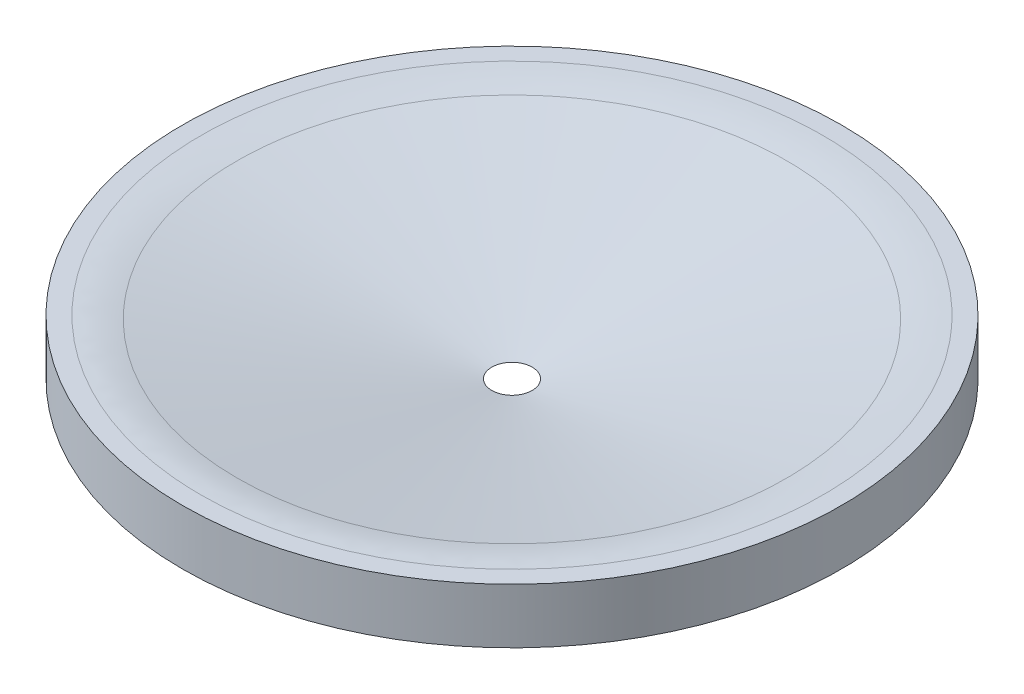
ISO-10303-21;
HEADER;
FILE_DESCRIPTION(('STEP AP214'),'2;1');
FILE_NAME('part.step','',(''),(''),'','','');
FILE_SCHEMA(('AUTOMOTIVE_DESIGN { 1 0 10303 214 1 1 1 1 }'));
ENDSEC;
DATA;
#1=APPLICATION_CONTEXT('core data for automotive mechanical design processes');
#2=APPLICATION_PROTOCOL_DEFINITION('international standard','automotive_design',2000,#1);
#3=PRODUCT_CONTEXT('',#1,'mechanical');
#4=PRODUCT('Part','Part','',(#3));
#5=PRODUCT_RELATED_PRODUCT_CATEGORY('part','',(#4));
#6=PRODUCT_DEFINITION_FORMATION('','',#4);
#7=PRODUCT_DEFINITION_CONTEXT('part definition',#1,'design');
#8=PRODUCT_DEFINITION('design','',#6,#7);
#9=PRODUCT_DEFINITION_SHAPE('','',#8);
#10=(LENGTH_UNIT() NAMED_UNIT(*) SI_UNIT(.MILLI.,.METRE.));
#11=(NAMED_UNIT(*) PLANE_ANGLE_UNIT() SI_UNIT($,.RADIAN.));
#12=(NAMED_UNIT(*) SI_UNIT($,.STERADIAN.) SOLID_ANGLE_UNIT());
#13=UNCERTAINTY_MEASURE_WITH_UNIT(LENGTH_MEASURE(1.E-05),#10,'distance_accuracy_value','');
#14=(GEOMETRIC_REPRESENTATION_CONTEXT(3) GLOBAL_UNCERTAINTY_ASSIGNED_CONTEXT((#13)) GLOBAL_UNIT_ASSIGNED_CONTEXT((#10,
#11,#12)) REPRESENTATION_CONTEXT('',''));
#15=CARTESIAN_POINT('',(0.,0.,0.));
#16=DIRECTION('',(0.,0.,1.));
#17=DIRECTION('',(1.,0.,0.));
#18=AXIS2_PLACEMENT_3D('',#15,#16,#17);
#19=CARTESIAN_POINT('',(0.,2.8019801980198,14.969801980198));
#20=CARTESIAN_POINT('',(0.979763120824126,2.8019801980198,14.969801980198));
#21=CARTESIAN_POINT('',(2.93928936247239,2.8019801980198,14.7768054907429));
#22=CARTESIAN_POINT('',(5.76562348311741,2.8019801980198,13.919446408479));
#23=CARTESIAN_POINT('',(8.37038792670522,2.8019801980198,12.5271708068526));
#24=CARTESIAN_POINT('',(10.6534830564372,2.8019801980198,10.6534830564373));
#25=CARTESIAN_POINT('',(12.5271708068526,2.8019801980198,8.3703879267052));
#26=CARTESIAN_POINT('',(13.9194464084789,2.8019801980198,5.76562348311746));
#27=CARTESIAN_POINT('',(14.7768054907429,2.8019801980198,2.93928936247243));
#28=CARTESIAN_POINT('',(15.0663002249256,2.8019801980198,0.));
#29=CARTESIAN_POINT('',(14.7768054907429,2.8019801980198,-2.93928936247238));
#30=CARTESIAN_POINT('',(13.919446408479,2.8019801980198,-5.76562348311741));
#31=CARTESIAN_POINT('',(12.5271708068526,2.8019801980198,-8.37038792670521));
#32=CARTESIAN_POINT('',(10.6534830564373,2.8019801980198,-10.6534830564372));
#33=CARTESIAN_POINT('',(8.3703879267052,2.8019801980198,-12.5271708068526));
#34=CARTESIAN_POINT('',(5.76562348311747,2.8019801980198,-13.9194464084789));
#35=CARTESIAN_POINT('',(2.93928936247242,2.8019801980198,-14.7768054907429));
#36=CARTESIAN_POINT('',(0.,2.8019801980198,-15.0663002249256));
#37=CARTESIAN_POINT('',(-2.93928936247236,2.8019801980198,-14.7768054907429));
#38=CARTESIAN_POINT('',(-5.76562348311742,2.8019801980198,-13.919446408479));
#39=CARTESIAN_POINT('',(-8.37038792670518,2.8019801980198,-12.5271708068526));
#40=CARTESIAN_POINT('',(-10.6534830564373,2.8019801980198,-10.6534830564373));
#41=CARTESIAN_POINT('',(-12.5271708068526,2.8019801980198,-8.37038792670521));
#42=CARTESIAN_POINT('',(-13.9194464084789,2.8019801980198,-5.76562348311746));
#43=CARTESIAN_POINT('',(-14.7768054907429,2.8019801980198,-2.93928936247243));
#44=CARTESIAN_POINT('',(-15.0663002249256,2.8019801980198,0.));
#45=CARTESIAN_POINT('',(-14.7768054907429,2.8019801980198,2.93928936247237));
#46=CARTESIAN_POINT('',(-13.9194464084789,2.8019801980198,5.76562348311746));
#47=CARTESIAN_POINT('',(-12.5271708068526,2.8019801980198,8.37038792670518));
#48=CARTESIAN_POINT('',(-10.6534830564373,2.8019801980198,10.6534830564373));
#49=CARTESIAN_POINT('',(-8.37038792670519,2.8019801980198,12.5271708068526));
#50=CARTESIAN_POINT('',(-5.76562348311744,2.8019801980198,13.9194464084789));
#51=CARTESIAN_POINT('',(-2.93928936247239,2.8019801980198,14.7768054907429));
#52=CARTESIAN_POINT('',(-0.97976312082413,2.8019801980198,14.969801980198));
#53=CARTESIAN_POINT('',(0.,2.8019801980198,14.969801980198));
#54=CARTESIAN_POINT('',(0.,2.83905349455881,15.1533147980661));
#55=CARTESIAN_POINT('',(0.991773907031153,2.83905349455881,15.1533147980661));
#56=CARTESIAN_POINT('',(2.97532172109347,2.83905349455881,14.9579523902331));
#57=CARTESIAN_POINT('',(5.83630349702493,2.83905349455881,14.0900830566432));
#58=CARTESIAN_POINT('',(8.47299940260254,2.83905349455881,12.6807397329961));
#59=CARTESIAN_POINT('',(10.7840826928508,2.83905349455881,10.7840826928509));
#60=CARTESIAN_POINT('',(12.6807397329962,2.83905349455881,8.47299940260252));
#61=CARTESIAN_POINT('',(14.0900830566432,2.83905349455881,5.83630349702498));
#62=CARTESIAN_POINT('',(14.9579523902331,2.83905349455881,2.97532172109351));
#63=CARTESIAN_POINT('',(15.2509960019826,2.83905349455881,0.));
#64=CARTESIAN_POINT('',(14.9579523902331,2.83905349455881,-2.97532172109346));
#65=CARTESIAN_POINT('',(14.0900830566433,2.83905349455881,-5.83630349702495));
#66=CARTESIAN_POINT('',(12.6807397329961,2.83905349455881,-8.47299940260253));
#67=CARTESIAN_POINT('',(10.7840826928509,2.83905349455881,-10.7840826928508));
#68=CARTESIAN_POINT('',(8.47299940260252,2.83905349455881,-12.6807397329962));
#69=CARTESIAN_POINT('',(5.83630349702499,2.83905349455881,-14.0900830566432));
#70=CARTESIAN_POINT('',(2.9753217210935,2.83905349455881,-14.9579523902331));
#71=CARTESIAN_POINT('',(0.,2.83905349455881,-15.2509960019826));
#72=CARTESIAN_POINT('',(-2.97532172109344,2.83905349455881,-14.9579523902331));
#73=CARTESIAN_POINT('',(-5.83630349702495,2.83905349455881,-14.0900830566432));
#74=CARTESIAN_POINT('',(-8.47299940260249,2.83905349455881,-12.6807397329962));
#75=CARTESIAN_POINT('',(-10.7840826928509,2.83905349455882,-10.7840826928508));
#76=CARTESIAN_POINT('',(-12.6807397329961,2.83905349455881,-8.47299940260253));
#77=CARTESIAN_POINT('',(-14.0900830566432,2.83905349455881,-5.83630349702499));
#78=CARTESIAN_POINT('',(-14.9579523902331,2.83905349455881,-2.97532172109351));
#79=CARTESIAN_POINT('',(-15.2509960019826,2.83905349455881,0.));
#80=CARTESIAN_POINT('',(-14.9579523902331,2.83905349455881,2.97532172109344));
#81=CARTESIAN_POINT('',(-14.0900830566432,2.83905349455882,5.836303497025));
#82=CARTESIAN_POINT('',(-12.6807397329962,2.8390534945588,8.47299940260248));
#83=CARTESIAN_POINT('',(-10.7840826928509,2.83905349455882,10.7840826928509));
#84=CARTESIAN_POINT('',(-8.47299940260252,2.83905349455881,12.6807397329962));
#85=CARTESIAN_POINT('',(-5.83630349702497,2.83905349455881,14.0900830566432));
#86=CARTESIAN_POINT('',(-2.97532172109347,2.83905349455881,14.9579523902331));
#87=CARTESIAN_POINT('',(-0.991773907031157,2.83905349455881,15.1533147980661));
#88=CARTESIAN_POINT('',(0.,2.83905349455881,15.1533147980661));
#89=CARTESIAN_POINT('',(0.,2.87612679109782,15.3368276159342));
#90=CARTESIAN_POINT('',(1.00378469323818,2.87612679109782,15.3368276159342));
#91=CARTESIAN_POINT('',(3.01135407971455,2.87612679109782,15.1390992897233));
#92=CARTESIAN_POINT('',(5.90698351093246,2.87612679109781,14.2607197048075));
#93=CARTESIAN_POINT('',(8.57561087849986,2.87612679109782,12.8343086591397));
#94=CARTESIAN_POINT('',(10.9146823292644,2.87612679109782,10.9146823292645));
#95=CARTESIAN_POINT('',(12.8343086591397,2.87612679109782,8.57561087849984));
#96=CARTESIAN_POINT('',(14.2607197048075,2.87612679109782,5.90698351093251));
#97=CARTESIAN_POINT('',(15.1390992897232,2.87612679109781,3.01135407971458));
#98=CARTESIAN_POINT('',(15.4356917790397,2.87612679109782,0.));
#99=CARTESIAN_POINT('',(15.1390992897233,2.87612679109782,-3.01135407971454));
#100=CARTESIAN_POINT('',(14.2607197048075,2.87612679109783,-5.90698351093248));
#101=CARTESIAN_POINT('',(12.8343086591397,2.87612679109781,-8.57561087849984));
#102=CARTESIAN_POINT('',(10.9146823292645,2.87612679109782,-10.9146823292644));
#103=CARTESIAN_POINT('',(8.57561087849983,2.87612679109782,-12.8343086591397));
#104=CARTESIAN_POINT('',(5.90698351093252,2.87612679109781,-14.2607197048074));
#105=CARTESIAN_POINT('',(3.01135407971458,2.87612679109783,-15.1390992897233));
#106=CARTESIAN_POINT('',(0.,2.87612679109782,-15.4356917790397));
#107=CARTESIAN_POINT('',(-3.01135407971453,2.87612679109782,-15.1390992897233));
#108=CARTESIAN_POINT('',(-5.90698351093248,2.87612679109782,-14.2607197048075));
#109=CARTESIAN_POINT('',(-8.5756108784998,2.87612679109781,-12.8343086591397));
#110=CARTESIAN_POINT('',(-10.9146823292645,2.87612679109783,-10.9146823292644));
#111=CARTESIAN_POINT('',(-12.8343086591397,2.87612679109782,-8.57561087849984));
#112=CARTESIAN_POINT('',(-14.2607197048075,2.87612679109782,-5.90698351093252));
#113=CARTESIAN_POINT('',(-15.1390992897233,2.87612679109782,-3.01135407971459));
#114=CARTESIAN_POINT('',(-15.4356917790397,2.87612679109782,0.));
#115=CARTESIAN_POINT('',(-15.1390992897233,2.87612679109782,3.01135407971452));
#116=CARTESIAN_POINT('',(-14.2607197048075,2.87612679109783,5.90698351093254));
#117=CARTESIAN_POINT('',(-12.8343086591397,2.87612679109781,8.57561087849979));
#118=CARTESIAN_POINT('',(-10.9146823292644,2.87612679109783,10.9146823292645));
#119=CARTESIAN_POINT('',(-8.57561087849985,2.87612679109782,12.8343086591397));
#120=CARTESIAN_POINT('',(-5.90698351093249,2.87612679109782,14.2607197048075));
#121=CARTESIAN_POINT('',(-3.01135407971455,2.87612679109782,15.1390992897233));
#122=CARTESIAN_POINT('',(-1.00378469323818,2.87612679109782,15.3368276159342));
#123=CARTESIAN_POINT('',(0.,2.87612679109782,15.3368276159342));
#124=CARTESIAN_POINT('',(0.,2.95037190209989,15.746442908138));
#125=CARTESIAN_POINT('',(1.03059372902621,2.95037190209989,15.746442908138));
#126=CARTESIAN_POINT('',(3.09178118707864,2.95037190209989,15.5434336628122));
#127=CARTESIAN_POINT('',(6.0647469570287,2.95037190209989,14.6415943560197));
#128=CARTESIAN_POINT('',(8.80464790256951,2.95037190209989,13.1770867892261));
#129=CARTESIAN_POINT('',(11.2061911669179,2.95037190209989,11.206191166918));
#130=CARTESIAN_POINT('',(13.1770867892261,2.95037190209989,8.80464790256948));
#131=CARTESIAN_POINT('',(14.6415943560197,2.95037190209989,6.06474695702874));
#132=CARTESIAN_POINT('',(15.5434336628122,2.95037190209989,3.09178118707869));
#133=CARTESIAN_POINT('',(15.8479475308009,2.95037190209989,0.));
#134=CARTESIAN_POINT('',(15.5434336628122,2.95037190209989,-3.09178118707863));
#135=CARTESIAN_POINT('',(14.6415943560198,2.95037190209989,-6.0647469570287));
#136=CARTESIAN_POINT('',(13.1770867892261,2.95037190209989,-8.80464790256951));
#137=CARTESIAN_POINT('',(11.206191166918,2.95037190209989,-11.2061911669179));
#138=CARTESIAN_POINT('',(8.80464790256948,2.95037190209989,-13.1770867892261));
#139=CARTESIAN_POINT('',(6.06474695702875,2.95037190209989,-14.6415943560197));
#140=CARTESIAN_POINT('',(3.09178118707867,2.95037190209988,-15.5434336628122));
#141=CARTESIAN_POINT('',(0.,2.95037190209989,-15.8479475308009));
#142=CARTESIAN_POINT('',(-3.09178118707861,2.95037190209989,-15.5434336628122));
#143=CARTESIAN_POINT('',(-6.06474695702872,2.95037190209989,-14.6415943560197));
#144=CARTESIAN_POINT('',(-8.80464790256945,2.95037190209989,-13.1770867892261));
#145=CARTESIAN_POINT('',(-11.2061911669179,2.95037190209989,-11.2061911669179));
#146=CARTESIAN_POINT('',(-13.1770867892261,2.95037190209989,-8.80464790256952));
#147=CARTESIAN_POINT('',(-14.6415943560197,2.95037190209989,-6.06474695702874));
#148=CARTESIAN_POINT('',(-15.5434336628122,2.95037190209988,-3.09178118707869));
#149=CARTESIAN_POINT('',(-15.8479475308009,2.95037190209989,0.));
#150=CARTESIAN_POINT('',(-15.5434336628122,2.95037190209989,3.09178118707861));
#151=CARTESIAN_POINT('',(-14.6415943560197,2.95037190209989,6.06474695702876));
#152=CARTESIAN_POINT('',(-13.1770867892261,2.95037190209988,8.80464790256944));
#153=CARTESIAN_POINT('',(-11.2061911669179,2.95037190209989,11.2061911669179));
#154=CARTESIAN_POINT('',(-8.80464790256948,2.95037190209988,13.1770867892261));
#155=CARTESIAN_POINT('',(-6.06474695702873,2.95037190209989,14.6415943560197));
#156=CARTESIAN_POINT('',(-3.09178118707864,2.95037190209988,15.5434336628122));
#157=CARTESIAN_POINT('',(-1.03059372902621,2.95037190209989,15.746442908138));
#158=CARTESIAN_POINT('',(0.,2.95037190209989,15.746442908138));
#159=CARTESIAN_POINT('',(0.,2.99166297173395,16.1593536044786));
#160=CARTESIAN_POINT('',(1.05761844672144,2.99166297173395,16.1593536044786));
#161=CARTESIAN_POINT('',(3.17285534016433,2.99166297173395,15.9510209544105));
#162=CARTESIAN_POINT('',(6.2237796289639,2.99166297173395,15.0255331894661));
#163=CARTESIAN_POINT('',(9.03552755695831,2.99166297173395,13.5226226104666));
#164=CARTESIAN_POINT('',(11.5000452281209,2.99166297173395,11.500045228121));
#165=CARTESIAN_POINT('',(13.5226226104666,2.99166297173395,9.03552755695828));
#166=CARTESIAN_POINT('',(15.0255331894661,2.99166297173395,6.22377962896394));
#167=CARTESIAN_POINT('',(15.9510209544106,2.99166297173395,3.17285534016437));
#168=CARTESIAN_POINT('',(16.2635199295126,2.99166297173395,0.));
#169=CARTESIAN_POINT('',(15.9510209544105,2.99166297173395,-3.17285534016432));
#170=CARTESIAN_POINT('',(15.0255331894661,2.99166297173395,-6.22377962896389));
#171=CARTESIAN_POINT('',(13.5226226104666,2.99166297173395,-9.0355275569583));
#172=CARTESIAN_POINT('',(11.500045228121,2.99166297173395,-11.5000452281209));
#173=CARTESIAN_POINT('',(9.03552755695828,2.99166297173395,-13.5226226104666));
#174=CARTESIAN_POINT('',(6.22377962896396,2.99166297173395,-15.0255331894661));
#175=CARTESIAN_POINT('',(3.17285534016435,2.99166297173395,-15.9510209544105));
#176=CARTESIAN_POINT('',(0.,2.99166297173395,-16.2635199295126));
#177=CARTESIAN_POINT('',(-3.1728553401643,2.99166297173395,-15.9510209544106));
#178=CARTESIAN_POINT('',(-6.22377962896392,2.99166297173395,-15.0255331894662));
#179=CARTESIAN_POINT('',(-9.03552755695825,2.99166297173395,-13.5226226104666));
#180=CARTESIAN_POINT('',(-11.5000452281209,2.99166297173395,-11.5000452281209));
#181=CARTESIAN_POINT('',(-13.5226226104666,2.99166297173395,-9.03552755695831));
#182=CARTESIAN_POINT('',(-15.0255331894661,2.99166297173395,-6.22377962896395));
#183=CARTESIAN_POINT('',(-15.9510209544106,2.99166297173395,-3.17285534016438));
#184=CARTESIAN_POINT('',(-16.2635199295126,2.99166297173395,0.));
#185=CARTESIAN_POINT('',(-15.9510209544106,2.99166297173395,3.17285534016431));
#186=CARTESIAN_POINT('',(-15.0255331894661,2.99166297173395,6.22377962896394));
#187=CARTESIAN_POINT('',(-13.5226226104666,2.99166297173395,9.03552755695825));
#188=CARTESIAN_POINT('',(-11.5000452281209,2.99166297173395,11.5000452281209));
#189=CARTESIAN_POINT('',(-9.03552755695826,2.99166297173394,13.5226226104666));
#190=CARTESIAN_POINT('',(-6.22377962896394,2.99166297173395,15.0255331894661));
#191=CARTESIAN_POINT('',(-3.17285534016432,2.99166297173394,15.9510209544105));
#192=CARTESIAN_POINT('',(-1.05761844672144,2.99166297173395,16.1593536044786));
#193=CARTESIAN_POINT('',(0.,2.99166297173395,16.1593536044786));
#194=CARTESIAN_POINT('',(0.,3.,16.575559704956));
#195=CARTESIAN_POINT('',(1.08485884632386,3.,16.575559704956));
#196=CARTESIAN_POINT('',(3.25457653897161,3.,16.3618611645182));
#197=CARTESIAN_POINT('',(6.38408152673806,3.,15.4125362051467));
#198=CARTESIAN_POINT('',(9.26824984166626,3.,13.8709161228612));
#199=CARTESIAN_POINT('',(11.7962445128734,3.,11.7962445128735));
#200=CARTESIAN_POINT('',(13.8709161228612,3.,9.26824984166623));
#201=CARTESIAN_POINT('',(15.4125362051467,3.,6.38408152673812));
#202=CARTESIAN_POINT('',(16.3618611645183,3.,3.25457653897165));
#203=CARTESIAN_POINT('',(16.6824089751749,3.,0.));
#204=CARTESIAN_POINT('',(16.3618611645183,3.,-3.2545765389716));
#205=CARTESIAN_POINT('',(15.4125362051466,3.,-6.38408152673805));
#206=CARTESIAN_POINT('',(13.8709161228611,3.,-9.26824984166623));
#207=CARTESIAN_POINT('',(11.7962445128735,3.,-11.7962445128734));
#208=CARTESIAN_POINT('',(9.26824984166622,3.,-13.8709161228612));
#209=CARTESIAN_POINT('',(6.38408152673814,3.,-15.4125362051467));
#210=CARTESIAN_POINT('',(3.25457653897164,3.,-16.3618611645183));
#211=CARTESIAN_POINT('',(0.,3.,-16.6824089751749));
#212=CARTESIAN_POINT('',(-3.25457653897158,3.,-16.3618611645183));
#213=CARTESIAN_POINT('',(-6.38408152673808,3.,-15.4125362051467));
#214=CARTESIAN_POINT('',(-9.26824984166621,3.,-13.8709161228612));
#215=CARTESIAN_POINT('',(-11.7962445128735,3.,-11.7962445128734));
#216=CARTESIAN_POINT('',(-13.8709161228611,3.,-9.26824984166624));
#217=CARTESIAN_POINT('',(-15.4125362051467,3.,-6.38408152673813));
#218=CARTESIAN_POINT('',(-16.3618611645183,3.,-3.25457653897166));
#219=CARTESIAN_POINT('',(-16.6824089751748,3.,0.));
#220=CARTESIAN_POINT('',(-16.3618611645183,3.,3.25457653897158));
#221=CARTESIAN_POINT('',(-15.4125362051466,3.,6.3840815267381));
#222=CARTESIAN_POINT('',(-13.8709161228612,3.,9.26824984166621));
#223=CARTESIAN_POINT('',(-11.7962445128734,3.,11.7962445128735));
#224=CARTESIAN_POINT('',(-9.2682498416662,2.99999999999999,13.8709161228611));
#225=CARTESIAN_POINT('',(-6.3840815267381,3.,15.4125362051467));
#226=CARTESIAN_POINT('',(-3.25457653897161,3.,16.3618611645183));
#227=CARTESIAN_POINT('',(-1.08485884632387,3.,16.575559704956));
#228=CARTESIAN_POINT('',(0.,3.,16.575559704956));
#229=CARTESIAN_POINT('',(0.,3.,16.762779852478));
#230=CARTESIAN_POINT('',(1.09711227467649,3.,16.762779852478));
#231=CARTESIAN_POINT('',(3.29133682402948,3.,16.5466675973315));
#232=CARTESIAN_POINT('',(6.45618941971443,3.,15.5866200583244));
#233=CARTESIAN_POINT('',(9.37293427667261,2.99999999999999,14.027587451553));
#234=CARTESIAN_POINT('',(11.9294825257802,3.,11.9294825257803));
#235=CARTESIAN_POINT('',(14.0275874515531,3.,9.37293427667258));
#236=CARTESIAN_POINT('',(15.5866200583244,3.,6.45618941971449));
#237=CARTESIAN_POINT('',(16.5466675973315,3.,3.29133682402952));
#238=CARTESIAN_POINT('',(16.8708359800513,3.,0.));
#239=CARTESIAN_POINT('',(16.5466675973315,3.,-3.29133682402946));
#240=CARTESIAN_POINT('',(15.5866200583244,3.,-6.45618941971442));
#241=CARTESIAN_POINT('',(14.027587451553,3.,-9.37293427667259));
#242=CARTESIAN_POINT('',(11.9294825257803,3.,-11.9294825257802));
#243=CARTESIAN_POINT('',(9.37293427667258,3.,-14.0275874515531));
#244=CARTESIAN_POINT('',(6.4561894197145,3.,-15.5866200583244));
#245=CARTESIAN_POINT('',(3.2913368240295,3.,-16.5466675973315));
#246=CARTESIAN_POINT('',(0.,3.,-16.8708359800513));
#247=CARTESIAN_POINT('',(-3.29133682402944,3.,-16.5466675973315));
#248=CARTESIAN_POINT('',(-6.45618941971445,3.,-15.5866200583244));
#249=CARTESIAN_POINT('',(-9.37293427667256,3.,-14.0275874515531));
#250=CARTESIAN_POINT('',(-11.9294825257802,3.,-11.9294825257802));
#251=CARTESIAN_POINT('',(-14.027587451553,3.,-9.3729342766726));
#252=CARTESIAN_POINT('',(-15.5866200583244,3.,-6.45618941971449));
#253=CARTESIAN_POINT('',(-16.5466675973315,2.99999999999999,-3.29133682402952));
#254=CARTESIAN_POINT('',(-16.8708359800512,3.,0.));
#255=CARTESIAN_POINT('',(-16.5466675973315,3.,3.29133682402945));
#256=CARTESIAN_POINT('',(-15.5866200583243,3.,6.45618941971448));
#257=CARTESIAN_POINT('',(-14.0275874515531,3.,9.37293427667256));
#258=CARTESIAN_POINT('',(-11.9294825257802,3.,11.9294825257802));
#259=CARTESIAN_POINT('',(-9.37293427667256,2.99999999999999,14.027587451553));
#260=CARTESIAN_POINT('',(-6.45618941971447,3.,15.5866200583244));
#261=CARTESIAN_POINT('',(-3.29133682402947,2.99999999999999,16.5466675973315));
#262=CARTESIAN_POINT('',(-1.09711227467649,3.,16.762779852478));
#263=CARTESIAN_POINT('',(0.,3.,16.762779852478));
#264=CARTESIAN_POINT('',(0.,3.,16.95));
#265=CARTESIAN_POINT('',(1.10936570302911,3.,16.95));
#266=CARTESIAN_POINT('',(3.32809710908735,3.,16.7314740301447));
#267=CARTESIAN_POINT('',(6.5282973126908,3.,15.7607039115021));
#268=CARTESIAN_POINT('',(9.47761871167896,2.99999999999999,14.1842587802449));
#269=CARTESIAN_POINT('',(12.062720538687,3.,12.062720538687));
#270=CARTESIAN_POINT('',(14.1842587802449,3.,9.47761871167893));
#271=CARTESIAN_POINT('',(15.760703911502,3.,6.52829731269085));
#272=CARTESIAN_POINT('',(16.7314740301447,3.,3.32809710908738));
#273=CARTESIAN_POINT('',(17.0592629849276,3.,0.));
#274=CARTESIAN_POINT('',(16.7314740301447,3.,-3.32809710908733));
#275=CARTESIAN_POINT('',(15.7607039115021,3.,-6.5282973126908));
#276=CARTESIAN_POINT('',(14.1842587802449,3.,-9.47761871167895));
#277=CARTESIAN_POINT('',(12.062720538687,3.,-12.0627205386869));
#278=CARTESIAN_POINT('',(9.47761871167893,3.,-14.1842587802449));
#279=CARTESIAN_POINT('',(6.52829731269086,3.,-15.760703911502));
#280=CARTESIAN_POINT('',(3.32809710908737,3.,-16.7314740301447));
#281=CARTESIAN_POINT('',(0.,3.,-17.0592629849276));
#282=CARTESIAN_POINT('',(-3.32809710908731,3.,-16.7314740301447));
#283=CARTESIAN_POINT('',(-6.52829731269081,3.,-15.7607039115021));
#284=CARTESIAN_POINT('',(-9.47761871167892,3.,-14.184258780245));
#285=CARTESIAN_POINT('',(-12.062720538687,3.,-12.062720538687));
#286=CARTESIAN_POINT('',(-14.1842587802449,3.,-9.47761871167895));
#287=CARTESIAN_POINT('',(-15.760703911502,3.,-6.52829731269086));
#288=CARTESIAN_POINT('',(-16.7314740301447,2.99999999999999,-3.32809710908739));
#289=CARTESIAN_POINT('',(-17.0592629849276,3.,0.));
#290=CARTESIAN_POINT('',(-16.7314740301447,3.,3.32809710908732));
#291=CARTESIAN_POINT('',(-15.760703911502,3.,6.52829731269085));
#292=CARTESIAN_POINT('',(-14.184258780245,3.,9.47761871167891));
#293=CARTESIAN_POINT('',(-12.062720538687,3.,12.062720538687));
#294=CARTESIAN_POINT('',(-9.47761871167892,2.99999999999999,14.1842587802449));
#295=CARTESIAN_POINT('',(-6.52829731269083,3.,15.7607039115021));
#296=CARTESIAN_POINT('',(-3.32809710908734,2.99999999999999,16.7314740301447));
#297=CARTESIAN_POINT('',(-1.10936570302911,3.,16.95));
#298=CARTESIAN_POINT('',(0.,3.,16.95));
#299=B_SPLINE_SURFACE_WITH_KNOTS('',5,3,((#19,#20,#21,#22,#23,#24,#25,#26,#27,#28,#29,#30,#31,
#32,#33,#34,#35,#36,#37,#38,#39,#40,#41,#42,#43,#44,#45,#46,#47,#48,#49,#50,#51,#52,#53),(#54,
#55,#56,#57,#58,#59,#60,#61,#62,#63,#64,#65,#66,#67,#68,#69,#70,#71,#72,#73,#74,#75,#76,#77,#78,
#79,#80,#81,#82,#83,#84,#85,#86,#87,#88),(#89,#90,#91,#92,#93,#94,#95,#96,#97,#98,#99,#100,#101,
#102,#103,#104,#105,#106,#107,#108,#109,#110,#111,#112,#113,#114,#115,#116,#117,#118,#119,#120,
#121,#122,#123),(#124,#125,#126,#127,#128,#129,#130,#131,#132,#133,#134,#135,#136,#137,#138,
#139,#140,#141,#142,#143,#144,#145,#146,#147,#148,#149,#150,#151,#152,#153,#154,#155,#156,#157,
#158),(#159,#160,#161,#162,#163,#164,#165,#166,#167,#168,#169,#170,#171,#172,#173,#174,#175,
#176,#177,#178,#179,#180,#181,#182,#183,#184,#185,#186,#187,#188,#189,#190,#191,#192,#193),
(#194,#195,#196,#197,#198,#199,#200,#201,#202,#203,#204,#205,#206,#207,#208,#209,#210,#211,#212,
#213,#214,#215,#216,#217,#218,#219,#220,#221,#222,#223,#224,#225,#226,#227,#228),(#229,#230,
#231,#232,#233,#234,#235,#236,#237,#238,#239,#240,#241,#242,#243,#244,#245,#246,#247,#248,#249,
#250,#251,#252,#253,#254,#255,#256,#257,#258,#259,#260,#261,#262,#263),(#264,#265,#266,#267,
#268,#269,#270,#271,#272,#273,#274,#275,#276,#277,#278,#279,#280,#281,#282,#283,#284,#285,#286,
#287,#288,#289,#290,#291,#292,#293,#294,#295,#296,#297,#298)),.UNSPECIFIED.,.F.,.T.,.F.,(6,2,6),
(4,1,1,1,1,1,1,1,1,1,1,1,1,1,1,1,1,1,1,1,1,1,1,1,1,1,1,1,1,1,1,1,4),(0.,0.5,1.),
(-6.28318530717959,-6.08683576633022,-5.89048622548086,-5.6941366846315,-5.49778714378214,
-5.30143760293278,-5.10508806208341,-4.90873852123405,-4.71238898038469,-4.51603943953533,
-4.31968989868597,-4.1233403578366,-3.92699081698724,-3.73064127613788,-3.53429173528852,
-3.33794219443915,-3.14159265358979,-2.94524311274043,-2.74889357189107,-2.55254403104171,
-2.35619449019234,-2.15984494934298,-1.96349540849362,-1.76714586764426,-1.5707963267949,
-1.37444678594553,-1.17809724509617,-0.98174770424681,-0.785398163397448,-0.589048622548086,
-0.392699081698724,-0.196349540849362,0.),.UNSPECIFIED.);
#300=CARTESIAN_POINT('',(0.,3.,16.95));
#301=CARTESIAN_POINT('',(1.10936570302911,3.,16.95));
#302=CARTESIAN_POINT('',(3.32809710908735,3.,16.7314740301447));
#303=CARTESIAN_POINT('',(6.5282973126908,3.,15.7607039115021));
#304=CARTESIAN_POINT('',(9.47761871167896,2.99999999999999,14.1842587802449));
#305=CARTESIAN_POINT('',(12.062720538687,3.,12.062720538687));
#306=CARTESIAN_POINT('',(14.1842587802449,3.,9.47761871167893));
#307=CARTESIAN_POINT('',(15.760703911502,3.,6.52829731269085));
#308=CARTESIAN_POINT('',(16.7314740301447,3.,3.32809710908738));
#309=CARTESIAN_POINT('',(17.0592629849276,3.,0.));
#310=CARTESIAN_POINT('',(16.7314740301447,3.,-3.32809710908733));
#311=CARTESIAN_POINT('',(15.7607039115021,3.,-6.5282973126908));
#312=CARTESIAN_POINT('',(14.1842587802449,3.,-9.47761871167895));
#313=CARTESIAN_POINT('',(12.062720538687,3.,-12.0627205386869));
#314=CARTESIAN_POINT('',(9.47761871167893,3.,-14.1842587802449));
#315=CARTESIAN_POINT('',(6.52829731269086,3.,-15.760703911502));
#316=CARTESIAN_POINT('',(3.32809710908737,3.,-16.7314740301447));
#317=CARTESIAN_POINT('',(0.,3.,-17.0592629849276));
#318=CARTESIAN_POINT('',(-3.32809710908731,3.,-16.7314740301447));
#319=CARTESIAN_POINT('',(-6.52829731269081,3.,-15.7607039115021));
#320=CARTESIAN_POINT('',(-9.47761871167892,3.,-14.184258780245));
#321=CARTESIAN_POINT('',(-12.062720538687,3.,-12.062720538687));
#322=CARTESIAN_POINT('',(-14.1842587802449,3.,-9.47761871167895));
#323=CARTESIAN_POINT('',(-15.760703911502,3.,-6.52829731269086));
#324=CARTESIAN_POINT('',(-16.7314740301447,2.99999999999999,-3.32809710908739));
#325=CARTESIAN_POINT('',(-17.0592629849276,3.,0.));
#326=CARTESIAN_POINT('',(-16.7314740301447,3.,3.32809710908732));
#327=CARTESIAN_POINT('',(-15.760703911502,3.,6.52829731269085));
#328=CARTESIAN_POINT('',(-14.184258780245,3.,9.47761871167891));
#329=CARTESIAN_POINT('',(-12.062720538687,3.,12.062720538687));
#330=CARTESIAN_POINT('',(-9.47761871167892,2.99999999999999,14.1842587802449));
#331=CARTESIAN_POINT('',(-6.52829731269083,3.,15.7607039115021));
#332=CARTESIAN_POINT('',(-3.32809710908734,2.99999999999999,16.7314740301447));
#333=CARTESIAN_POINT('',(-1.10936570302911,3.,16.95));
#334=CARTESIAN_POINT('',(0.,3.,16.95));
#335=B_SPLINE_CURVE_WITH_KNOTS('',3,(#300,#301,#302,#303,#304,#305,#306,#307,#308,#309,#310,
#311,#312,#313,#314,#315,#316,#317,#318,#319,#320,#321,#322,#323,#324,#325,#326,#327,#328,#329,
#330,#331,#332,#333,#334),.UNSPECIFIED.,.T.,.F.,(4,1,1,1,1,1,1,1,1,1,1,1,1,1,1,1,1,1,1,1,1,1,1,
1,1,1,1,1,1,1,1,1,4),(-6.28318530717959,-6.08683576633022,-5.89048622548086,-5.6941366846315,
-5.49778714378214,-5.30143760293278,-5.10508806208341,-4.90873852123405,-4.71238898038469,
-4.51603943953533,-4.31968989868597,-4.1233403578366,-3.92699081698724,-3.73064127613788,
-3.53429173528852,-3.33794219443915,-3.14159265358979,-2.94524311274043,-2.74889357189107,
-2.55254403104171,-2.35619449019234,-2.15984494934298,-1.96349540849362,-1.76714586764426,
-1.5707963267949,-1.37444678594553,-1.17809724509617,-0.98174770424681,-0.785398163397448,
-0.589048622548086,-0.392699081698724,-0.196349540849362,0.),.UNSPECIFIED.);
#336=CARTESIAN_POINT('',(0.,3.,16.95));
#337=VERTEX_POINT('',#336);
#338=EDGE_CURVE('E53',#337,#337,#335,.F.);
#339=CARTESIAN_POINT('',(0.,2.8019801980198,14.969801980198));
#340=CARTESIAN_POINT('',(-0.97976312082413,2.8019801980198,14.969801980198));
#341=CARTESIAN_POINT('',(-2.93928936247239,2.8019801980198,14.7768054907429));
#342=CARTESIAN_POINT('',(-5.76562348311744,2.8019801980198,13.9194464084789));
#343=CARTESIAN_POINT('',(-8.37038792670519,2.8019801980198,12.5271708068526));
#344=CARTESIAN_POINT('',(-10.6534830564373,2.8019801980198,10.6534830564373));
#345=CARTESIAN_POINT('',(-12.5271708068526,2.8019801980198,8.37038792670518));
#346=CARTESIAN_POINT('',(-13.9194464084789,2.8019801980198,5.76562348311746));
#347=CARTESIAN_POINT('',(-14.7768054907429,2.8019801980198,2.93928936247237));
#348=CARTESIAN_POINT('',(-15.0663002249256,2.8019801980198,0.));
#349=CARTESIAN_POINT('',(-14.7768054907429,2.8019801980198,-2.93928936247243));
#350=CARTESIAN_POINT('',(-13.9194464084789,2.8019801980198,-5.76562348311746));
#351=CARTESIAN_POINT('',(-12.5271708068526,2.8019801980198,-8.37038792670521));
#352=CARTESIAN_POINT('',(-10.6534830564373,2.8019801980198,-10.6534830564373));
#353=CARTESIAN_POINT('',(-8.37038792670518,2.8019801980198,-12.5271708068526));
#354=CARTESIAN_POINT('',(-5.76562348311742,2.8019801980198,-13.919446408479));
#355=CARTESIAN_POINT('',(-2.93928936247236,2.8019801980198,-14.7768054907429));
#356=CARTESIAN_POINT('',(0.,2.8019801980198,-15.0663002249256));
#357=CARTESIAN_POINT('',(2.93928936247242,2.8019801980198,-14.7768054907429));
#358=CARTESIAN_POINT('',(5.76562348311747,2.8019801980198,-13.9194464084789));
#359=CARTESIAN_POINT('',(8.3703879267052,2.8019801980198,-12.5271708068526));
#360=CARTESIAN_POINT('',(10.6534830564373,2.8019801980198,-10.6534830564372));
#361=CARTESIAN_POINT('',(12.5271708068526,2.8019801980198,-8.37038792670521));
#362=CARTESIAN_POINT('',(13.919446408479,2.8019801980198,-5.76562348311741));
#363=CARTESIAN_POINT('',(14.7768054907429,2.8019801980198,-2.93928936247238));
#364=CARTESIAN_POINT('',(15.0663002249256,2.8019801980198,0.));
#365=CARTESIAN_POINT('',(14.7768054907429,2.8019801980198,2.93928936247243));
#366=CARTESIAN_POINT('',(13.9194464084789,2.8019801980198,5.76562348311746));
#367=CARTESIAN_POINT('',(12.5271708068526,2.8019801980198,8.3703879267052));
#368=CARTESIAN_POINT('',(10.6534830564372,2.8019801980198,10.6534830564373));
#369=CARTESIAN_POINT('',(8.37038792670522,2.8019801980198,12.5271708068526));
#370=CARTESIAN_POINT('',(5.76562348311741,2.8019801980198,13.919446408479));
#371=CARTESIAN_POINT('',(2.93928936247239,2.8019801980198,14.7768054907429));
#372=CARTESIAN_POINT('',(0.979763120824126,2.8019801980198,14.969801980198));
#373=CARTESIAN_POINT('',(0.,2.8019801980198,14.969801980198));
#374=B_SPLINE_CURVE_WITH_KNOTS('',3,(#339,#340,#341,#342,#343,#344,#345,#346,#347,#348,#349,
#350,#351,#352,#353,#354,#355,#356,#357,#358,#359,#360,#361,#362,#363,#364,#365,#366,#367,#368,
#369,#370,#371,#372,#373),.UNSPECIFIED.,.T.,.F.,(4,1,1,1,1,1,1,1,1,1,1,1,1,1,1,1,1,1,1,1,1,1,1,
1,1,1,1,1,1,1,1,1,4),(-6.28318530717959,-6.08683576633022,-5.89048622548086,-5.6941366846315,
-5.49778714378214,-5.30143760293278,-5.10508806208341,-4.90873852123405,-4.71238898038469,
-4.51603943953533,-4.31968989868597,-4.1233403578366,-3.92699081698724,-3.73064127613788,
-3.53429173528852,-3.33794219443915,-3.14159265358979,-2.94524311274043,-2.74889357189107,
-2.55254403104171,-2.35619449019234,-2.15984494934298,-1.96349540849362,-1.76714586764426,
-1.5707963267949,-1.37444678594553,-1.17809724509617,-0.981747704246811,-0.785398163397448,
-0.589048622548087,-0.392699081698725,-0.196349540849361,0.),.UNSPECIFIED.);
#375=CARTESIAN_POINT('',(0.,2.8019801980198,14.969801980198));
#376=VERTEX_POINT('',#375);
#377=EDGE_CURVE('E10',#376,#376,#374,.F.);
#378=ORIENTED_EDGE('',*,*,#338,.F.);
#379=EDGE_LOOP('',(#378));
#380=FACE_BOUND('',#379,.T.);
#381=ORIENTED_EDGE('',*,*,#377,.F.);
#382=EDGE_LOOP('',(#381));
#383=FACE_BOUND('',#382,.T.);
#384=ADVANCED_FACE('F41',(#380,#383),#299,.T.);
#385=CARTESIAN_POINT('',(0.,3.,0.));
#386=DIRECTION('',(0.,1.,0.));
#387=DIRECTION('',(0.,0.,1.));
#388=AXIS2_PLACEMENT_3D('',#385,#386,#387);
#389=CONICAL_SURFACE('',#388,15.95,1.37145902181257);
#390=ORIENTED_EDGE('',*,*,#377,.T.);
#391=EDGE_LOOP('',(#390));
#392=FACE_BOUND('',#391,.T.);
#393=CARTESIAN_POINT('',(0.,0.,0.));
#394=DIRECTION('',(0.,-1.,0.));
#395=DIRECTION('',(0.,0.,-1.));
#396=AXIS2_PLACEMENT_3D('',#393,#394,#395);
#397=CIRCLE('',#396,1.1);
#398=CARTESIAN_POINT('',(0.,0.,-1.1));
#399=VERTEX_POINT('',#398);
#400=EDGE_CURVE('E68',#399,#399,#397,.T.);
#401=ORIENTED_EDGE('',*,*,#400,.T.);
#402=EDGE_LOOP('',(#401));
#403=FACE_BOUND('',#402,.T.);
#404=ADVANCED_FACE('F86',(#392,#403),#389,.F.);
#405=CARTESIAN_POINT('',(-17.95,3.,0.));
#406=DIRECTION('',(0.,1.,0.));
#407=DIRECTION('',(0.,0.,1.));
#408=AXIS2_PLACEMENT_3D('',#405,#406,#407);
#409=PLANE('',#408);
#410=ORIENTED_EDGE('',*,*,#338,.T.);
#411=EDGE_LOOP('',(#410));
#412=FACE_BOUND('',#411,.T.);
#413=CARTESIAN_POINT('',(0.,3.,0.));
#414=DIRECTION('',(0.,-1.,0.));
#415=DIRECTION('',(0.,0.,-1.));
#416=AXIS2_PLACEMENT_3D('',#413,#414,#415);
#417=CIRCLE('',#416,17.95);
#418=CARTESIAN_POINT('',(0.,3.,-17.95));
#419=VERTEX_POINT('',#418);
#420=EDGE_CURVE('E58',#419,#419,#417,.T.);
#421=ORIENTED_EDGE('',*,*,#420,.F.);
#422=EDGE_LOOP('',(#421));
#423=FACE_BOUND('',#422,.T.);
#424=ADVANCED_FACE('F76',(#412,#423),#409,.T.);
#425=CARTESIAN_POINT('',(0.,0.,0.));
#426=DIRECTION('',(0.,-1.,0.));
#427=DIRECTION('',(0.,0.,-1.));
#428=AXIS2_PLACEMENT_3D('',#425,#426,#427);
#429=CYLINDRICAL_SURFACE('',#428,17.95);
#430=ORIENTED_EDGE('',*,*,#420,.T.);
#431=EDGE_LOOP('',(#430));
#432=FACE_BOUND('',#431,.T.);
#433=CARTESIAN_POINT('',(0.,0.,0.));
#434=DIRECTION('',(0.,-1.,0.));
#435=DIRECTION('',(0.,0.,-1.));
#436=AXIS2_PLACEMENT_3D('',#433,#434,#435);
#437=CIRCLE('',#436,17.95);
#438=CARTESIAN_POINT('',(0.,0.,-17.95));
#439=VERTEX_POINT('',#438);
#440=EDGE_CURVE('E63',#439,#439,#437,.T.);
#441=ORIENTED_EDGE('',*,*,#440,.F.);
#442=EDGE_LOOP('',(#441));
#443=FACE_BOUND('',#442,.T.);
#444=ADVANCED_FACE('F85',(#432,#443),#429,.T.);
#445=CARTESIAN_POINT('',(-1.1,0.,0.));
#446=DIRECTION('',(0.,-1.,0.));
#447=DIRECTION('',(0.,0.,-1.));
#448=AXIS2_PLACEMENT_3D('',#445,#446,#447);
#449=PLANE('',#448);
#450=ORIENTED_EDGE('',*,*,#440,.T.);
#451=EDGE_LOOP('',(#450));
#452=FACE_BOUND('',#451,.T.);
#453=ORIENTED_EDGE('',*,*,#400,.F.);
#454=EDGE_LOOP('',(#453));
#455=FACE_BOUND('',#454,.T.);
#456=ADVANCED_FACE('F116',(#452,#455),#449,.T.);
#457=CLOSED_SHELL('',(#384,#404,#424,#444,#456));
#458=MANIFOLD_SOLID_BREP('B2',#457);
#459=ADVANCED_BREP_SHAPE_REPRESENTATION('',(#18,#458),#14);
#460=SHAPE_DEFINITION_REPRESENTATION(#9,#459);
ENDSEC;
END-ISO-10303-21;
